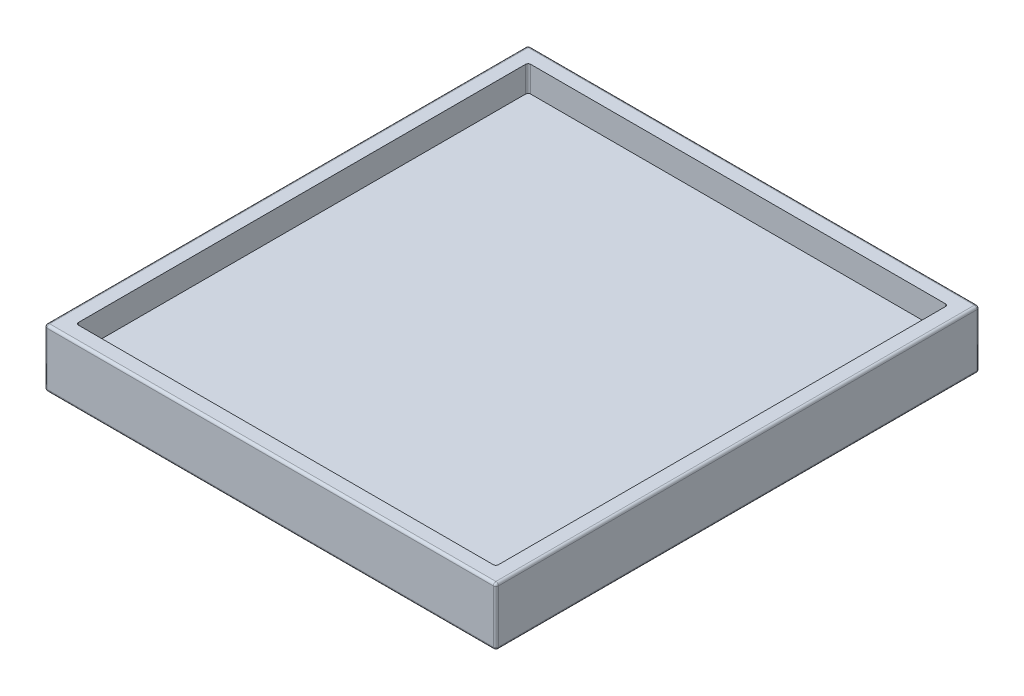
ISO-10303-21;
HEADER;
FILE_DESCRIPTION(('STEP AP214'),'2;1');
FILE_NAME('part.step','',(''),(''),'','','');
FILE_SCHEMA(('AUTOMOTIVE_DESIGN { 1 0 10303 214 1 1 1 1 }'));
ENDSEC;
DATA;
#1=APPLICATION_CONTEXT('core data for automotive mechanical design processes');
#2=APPLICATION_PROTOCOL_DEFINITION('international standard','automotive_design',2000,#1);
#3=PRODUCT_CONTEXT('',#1,'mechanical');
#4=PRODUCT('Part','Part','',(#3));
#5=PRODUCT_RELATED_PRODUCT_CATEGORY('part','',(#4));
#6=PRODUCT_DEFINITION_FORMATION('','',#4);
#7=PRODUCT_DEFINITION_CONTEXT('part definition',#1,'design');
#8=PRODUCT_DEFINITION('design','',#6,#7);
#9=PRODUCT_DEFINITION_SHAPE('','',#8);
#10=(LENGTH_UNIT() NAMED_UNIT(*) SI_UNIT(.MILLI.,.METRE.));
#11=(NAMED_UNIT(*) PLANE_ANGLE_UNIT() SI_UNIT($,.RADIAN.));
#12=(NAMED_UNIT(*) SI_UNIT($,.STERADIAN.) SOLID_ANGLE_UNIT());
#13=UNCERTAINTY_MEASURE_WITH_UNIT(LENGTH_MEASURE(1.E-05),#10,'distance_accuracy_value','');
#14=(GEOMETRIC_REPRESENTATION_CONTEXT(3) GLOBAL_UNCERTAINTY_ASSIGNED_CONTEXT((#13)) GLOBAL_UNIT_ASSIGNED_CONTEXT((#10,
#11,#12)) REPRESENTATION_CONTEXT('',''));
#15=CARTESIAN_POINT('',(0.,0.,0.));
#16=DIRECTION('',(0.,0.,1.));
#17=DIRECTION('',(1.,0.,0.));
#18=AXIS2_PLACEMENT_3D('',#15,#16,#17);
#19=CARTESIAN_POINT('',(0.,9.,0.));
#20=DIRECTION('',(1.,0.,0.));
#21=DIRECTION('',(0.,0.,-1.));
#22=AXIS2_PLACEMENT_3D('',#19,#20,#21);
#23=PLANE('',#22);
#24=DIRECTION('',(0.,0.,1.));
#25=VECTOR('',#24,1.);
#26=CARTESIAN_POINT('',(0.,8.6,0.));
#27=LINE('',#26,#25);
#28=CARTESIAN_POINT('',(0.,8.6,-0.4));
#29=VERTEX_POINT('',#28);
#30=CARTESIAN_POINT('',(0.,8.6,-74.6));
#31=VERTEX_POINT('',#30);
#32=EDGE_CURVE('E281',#29,#31,#27,.F.);
#33=ORIENTED_EDGE('',*,*,#32,.T.);
#34=DIRECTION('',(0.,-1.,0.));
#35=VECTOR('',#34,1.);
#36=CARTESIAN_POINT('',(0.,9.,-74.6));
#37=LINE('',#36,#35);
#38=CARTESIAN_POINT('',(0.,0.399999999999999,-74.6));
#39=VERTEX_POINT('',#38);
#40=EDGE_CURVE('E284',#31,#39,#37,.T.);
#41=ORIENTED_EDGE('',*,*,#40,.T.);
#42=DIRECTION('',(0.,0.,1.));
#43=VECTOR('',#42,1.);
#44=CARTESIAN_POINT('',(0.,0.399999999999999,0.));
#45=LINE('',#44,#43);
#46=CARTESIAN_POINT('',(0.,0.399999999999999,-0.4));
#47=VERTEX_POINT('',#46);
#48=EDGE_CURVE('E279',#39,#47,#45,.T.);
#49=ORIENTED_EDGE('',*,*,#48,.T.);
#50=DIRECTION('',(0.,-1.,0.));
#51=VECTOR('',#50,1.);
#52=CARTESIAN_POINT('',(0.,9.,-0.4));
#53=LINE('',#52,#51);
#54=EDGE_CURVE('E277',#47,#29,#53,.F.);
#55=ORIENTED_EDGE('',*,*,#54,.T.);
#56=EDGE_LOOP('',(#33,#41,#49,#55));
#57=FACE_BOUND('',#56,.T.);
#58=ADVANCED_FACE('F43',(#57),#23,.F.);
#59=CARTESIAN_POINT('',(0.,9.,0.));
#60=DIRECTION('',(0.,0.,-1.));
#61=DIRECTION('',(-1.,0.,0.));
#62=AXIS2_PLACEMENT_3D('',#59,#60,#61);
#63=PLANE('',#62);
#64=DIRECTION('',(1.,0.,0.));
#65=VECTOR('',#64,1.);
#66=CARTESIAN_POINT('',(70.,0.399999999999999,0.));
#67=LINE('',#66,#65);
#68=CARTESIAN_POINT('',(0.4,0.399999999999999,0.));
#69=VERTEX_POINT('',#68);
#70=CARTESIAN_POINT('',(69.6,0.399999999999999,0.));
#71=VERTEX_POINT('',#70);
#72=EDGE_CURVE('E191',#69,#71,#67,.T.);
#73=ORIENTED_EDGE('',*,*,#72,.T.);
#74=DIRECTION('',(0.,-1.,0.));
#75=VECTOR('',#74,1.);
#76=CARTESIAN_POINT('',(69.6,9.,0.));
#77=LINE('',#76,#75);
#78=CARTESIAN_POINT('',(69.6,8.6,0.));
#79=VERTEX_POINT('',#78);
#80=EDGE_CURVE('E248',#71,#79,#77,.F.);
#81=ORIENTED_EDGE('',*,*,#80,.T.);
#82=DIRECTION('',(1.,0.,0.));
#83=VECTOR('',#82,1.);
#84=CARTESIAN_POINT('',(0.,8.6,0.));
#85=LINE('',#84,#83);
#86=CARTESIAN_POINT('',(0.4,8.6,0.));
#87=VERTEX_POINT('',#86);
#88=EDGE_CURVE('E245',#79,#87,#85,.F.);
#89=ORIENTED_EDGE('',*,*,#88,.T.);
#90=DIRECTION('',(0.,-1.,0.));
#91=VECTOR('',#90,1.);
#92=CARTESIAN_POINT('',(0.4,9.,0.));
#93=LINE('',#92,#91);
#94=EDGE_CURVE('E243',#87,#69,#93,.T.);
#95=ORIENTED_EDGE('',*,*,#94,.T.);
#96=EDGE_LOOP('',(#73,#81,#89,#95));
#97=FACE_BOUND('',#96,.T.);
#98=ADVANCED_FACE('F425',(#97),#63,.F.);
#99=CARTESIAN_POINT('',(70.,9.,0.));
#100=DIRECTION('',(-1.,0.,0.));
#101=DIRECTION('',(0.,0.,1.));
#102=AXIS2_PLACEMENT_3D('',#99,#100,#101);
#103=PLANE('',#102);
#104=DIRECTION('',(0.,0.,-1.));
#105=VECTOR('',#104,1.);
#106=CARTESIAN_POINT('',(70.,0.399999999999999,-75.));
#107=LINE('',#106,#105);
#108=CARTESIAN_POINT('',(70.,0.399999999999999,-0.4));
#109=VERTEX_POINT('',#108);
#110=CARTESIAN_POINT('',(70.,0.399999999999999,-74.6));
#111=VERTEX_POINT('',#110);
#112=EDGE_CURVE('E254',#109,#111,#107,.T.);
#113=ORIENTED_EDGE('',*,*,#112,.T.);
#114=DIRECTION('',(0.,-1.,0.));
#115=VECTOR('',#114,1.);
#116=CARTESIAN_POINT('',(70.,9.,-74.6));
#117=LINE('',#116,#115);
#118=CARTESIAN_POINT('',(70.,8.6,-74.6));
#119=VERTEX_POINT('',#118);
#120=EDGE_CURVE('E257',#111,#119,#117,.F.);
#121=ORIENTED_EDGE('',*,*,#120,.T.);
#122=DIRECTION('',(0.,0.,-1.));
#123=VECTOR('',#122,1.);
#124=CARTESIAN_POINT('',(70.,8.6,0.));
#125=LINE('',#124,#123);
#126=CARTESIAN_POINT('',(70.,8.6,-0.4));
#127=VERTEX_POINT('',#126);
#128=EDGE_CURVE('E252',#119,#127,#125,.F.);
#129=ORIENTED_EDGE('',*,*,#128,.T.);
#130=DIRECTION('',(0.,-1.,0.));
#131=VECTOR('',#130,1.);
#132=CARTESIAN_POINT('',(70.,9.,-0.4));
#133=LINE('',#132,#131);
#134=EDGE_CURVE('E250',#127,#109,#133,.T.);
#135=ORIENTED_EDGE('',*,*,#134,.T.);
#136=EDGE_LOOP('',(#113,#121,#129,#135));
#137=FACE_BOUND('',#136,.T.);
#138=ADVANCED_FACE('F474',(#137),#103,.F.);
#139=CARTESIAN_POINT('',(0.,9.,-75.));
#140=DIRECTION('',(0.,0.,1.));
#141=DIRECTION('',(1.,0.,0.));
#142=AXIS2_PLACEMENT_3D('',#139,#140,#141);
#143=PLANE('',#142);
#144=DIRECTION('',(-1.,0.,0.));
#145=VECTOR('',#144,1.);
#146=CARTESIAN_POINT('',(0.,0.399999999999999,-75.));
#147=LINE('',#146,#145);
#148=CARTESIAN_POINT('',(69.6,0.399999999999999,-75.));
#149=VERTEX_POINT('',#148);
#150=CARTESIAN_POINT('',(0.4,0.399999999999999,-75.));
#151=VERTEX_POINT('',#150);
#152=EDGE_CURVE('E263',#149,#151,#147,.T.);
#153=ORIENTED_EDGE('',*,*,#152,.T.);
#154=DIRECTION('',(0.,-1.,0.));
#155=VECTOR('',#154,1.);
#156=CARTESIAN_POINT('',(0.4,9.,-75.));
#157=LINE('',#156,#155);
#158=CARTESIAN_POINT('',(0.4,8.6,-75.));
#159=VERTEX_POINT('',#158);
#160=EDGE_CURVE('E266',#151,#159,#157,.F.);
#161=ORIENTED_EDGE('',*,*,#160,.T.);
#162=DIRECTION('',(-1.,0.,0.));
#163=VECTOR('',#162,1.);
#164=CARTESIAN_POINT('',(0.,8.6,-75.));
#165=LINE('',#164,#163);
#166=CARTESIAN_POINT('',(69.6,8.6,-75.));
#167=VERTEX_POINT('',#166);
#168=EDGE_CURVE('E261',#159,#167,#165,.F.);
#169=ORIENTED_EDGE('',*,*,#168,.T.);
#170=DIRECTION('',(0.,-1.,0.));
#171=VECTOR('',#170,1.);
#172=CARTESIAN_POINT('',(69.6,9.,-75.));
#173=LINE('',#172,#171);
#174=EDGE_CURVE('E259',#167,#149,#173,.T.);
#175=ORIENTED_EDGE('',*,*,#174,.T.);
#176=EDGE_LOOP('',(#153,#161,#169,#175));
#177=FACE_BOUND('',#176,.T.);
#178=ADVANCED_FACE('F524',(#177),#143,.F.);
#179=CARTESIAN_POINT('',(0.,9.,0.));
#180=DIRECTION('',(0.,-1.,0.));
#181=DIRECTION('',(0.,0.,-1.));
#182=AXIS2_PLACEMENT_3D('',#179,#180,#181);
#183=PLANE('',#182);
#184=DIRECTION('',(-1.,0.,0.));
#185=VECTOR('',#184,1.);
#186=CARTESIAN_POINT('',(0.,9.,-74.6));
#187=LINE('',#186,#185);
#188=CARTESIAN_POINT('',(69.6,9.,-74.6));
#189=VERTEX_POINT('',#188);
#190=CARTESIAN_POINT('',(0.4,9.,-74.6));
#191=VERTEX_POINT('',#190);
#192=EDGE_CURVE('E268',#189,#191,#187,.T.);
#193=ORIENTED_EDGE('',*,*,#192,.T.);
#194=DIRECTION('',(0.,0.,1.));
#195=VECTOR('',#194,1.);
#196=CARTESIAN_POINT('',(0.4,9.,0.));
#197=LINE('',#196,#195);
#198=CARTESIAN_POINT('',(0.4,9.,-0.4));
#199=VERTEX_POINT('',#198);
#200=EDGE_CURVE('E274',#191,#199,#197,.T.);
#201=ORIENTED_EDGE('',*,*,#200,.T.);
#202=DIRECTION('',(1.,0.,0.));
#203=VECTOR('',#202,1.);
#204=CARTESIAN_POINT('',(0.,9.,-0.4));
#205=LINE('',#204,#203);
#206=CARTESIAN_POINT('',(69.6,9.,-0.4));
#207=VERTEX_POINT('',#206);
#208=EDGE_CURVE('E272',#199,#207,#205,.T.);
#209=ORIENTED_EDGE('',*,*,#208,.T.);
#210=DIRECTION('',(0.,0.,-1.));
#211=VECTOR('',#210,1.);
#212=CARTESIAN_POINT('',(69.6,9.,0.));
#213=LINE('',#212,#211);
#214=EDGE_CURVE('E270',#207,#189,#213,.T.);
#215=ORIENTED_EDGE('',*,*,#214,.T.);
#216=EDGE_LOOP('',(#193,#201,#209,#215));
#217=FACE_BOUND('',#216,.T.);
#218=DIRECTION('',(0.,0.,1.));
#219=VECTOR('',#218,1.);
#220=CARTESIAN_POINT('',(2.45000000000002,9.,-2.45000000000002));
#221=LINE('',#220,#219);
#222=CARTESIAN_POINT('',(2.45000000000002,9.,-72.15));
#223=VERTEX_POINT('',#222);
#224=CARTESIAN_POINT('',(2.45000000000002,9.,-2.85000000000002));
#225=VERTEX_POINT('',#224);
#226=EDGE_CURVE('E383',#223,#225,#221,.T.);
#227=ORIENTED_EDGE('',*,*,#226,.F.);
#228=CARTESIAN_POINT('',(2.85000000000002,8.99999999999999,-72.15));
#229=DIRECTION('',(0.,-1.,0.));
#230=DIRECTION('',(0.,0.,-1.));
#231=AXIS2_PLACEMENT_3D('',#228,#229,#230);
#232=CIRCLE('',#231,0.4);
#233=CARTESIAN_POINT('',(2.85000000000002,9.,-72.55));
#234=VERTEX_POINT('',#233);
#235=EDGE_CURVE('E12',#223,#234,#232,.T.);
#236=ORIENTED_EDGE('',*,*,#235,.T.);
#237=DIRECTION('',(-1.,0.,0.));
#238=VECTOR('',#237,1.);
#239=CARTESIAN_POINT('',(2.45000000000002,9.,-72.55));
#240=LINE('',#239,#238);
#241=CARTESIAN_POINT('',(67.15,9.,-72.55));
#242=VERTEX_POINT('',#241);
#243=EDGE_CURVE('E378',#242,#234,#240,.T.);
#244=ORIENTED_EDGE('',*,*,#243,.F.);
#245=CARTESIAN_POINT('',(67.15,8.99999999999999,-72.15));
#246=DIRECTION('',(0.,-1.,0.));
#247=DIRECTION('',(0.,0.,-1.));
#248=AXIS2_PLACEMENT_3D('',#245,#246,#247);
#249=CIRCLE('',#248,0.4);
#250=CARTESIAN_POINT('',(67.55,9.,-72.15));
#251=VERTEX_POINT('',#250);
#252=EDGE_CURVE('E52',#242,#251,#249,.T.);
#253=ORIENTED_EDGE('',*,*,#252,.T.);
#254=DIRECTION('',(0.,0.,-1.));
#255=VECTOR('',#254,1.);
#256=CARTESIAN_POINT('',(67.55,9.,-2.45000000000002));
#257=LINE('',#256,#255);
#258=CARTESIAN_POINT('',(67.55,9.,-2.85000000000002));
#259=VERTEX_POINT('',#258);
#260=EDGE_CURVE('E372',#259,#251,#257,.T.);
#261=ORIENTED_EDGE('',*,*,#260,.F.);
#262=CARTESIAN_POINT('',(67.15,8.99999999999999,-2.85000000000002));
#263=DIRECTION('',(0.,-1.,0.));
#264=DIRECTION('',(0.,0.,-1.));
#265=AXIS2_PLACEMENT_3D('',#262,#263,#264);
#266=CIRCLE('',#265,0.4);
#267=CARTESIAN_POINT('',(67.15,9.,-2.45000000000002));
#268=VERTEX_POINT('',#267);
#269=EDGE_CURVE('E314',#259,#268,#266,.T.);
#270=ORIENTED_EDGE('',*,*,#269,.T.);
#271=DIRECTION('',(1.,0.,0.));
#272=VECTOR('',#271,1.);
#273=CARTESIAN_POINT('',(2.45000000000002,9.,-2.45000000000002));
#274=LINE('',#273,#272);
#275=CARTESIAN_POINT('',(2.85000000000002,9.,-2.45000000000002));
#276=VERTEX_POINT('',#275);
#277=EDGE_CURVE('E390',#276,#268,#274,.T.);
#278=ORIENTED_EDGE('',*,*,#277,.F.);
#279=CARTESIAN_POINT('',(2.85000000000002,8.99999999999999,-2.85000000000002));
#280=DIRECTION('',(0.,-1.,0.));
#281=DIRECTION('',(0.,0.,-1.));
#282=AXIS2_PLACEMENT_3D('',#279,#280,#281);
#283=CIRCLE('',#282,0.4);
#284=EDGE_CURVE('E312',#276,#225,#283,.T.);
#285=ORIENTED_EDGE('',*,*,#284,.T.);
#286=EDGE_LOOP('',(#227,#236,#244,#253,#261,#270,#278,#285));
#287=FACE_BOUND('',#286,.T.);
#288=ADVANCED_FACE('F446',(#217,#287),#183,.F.);
#289=CARTESIAN_POINT('',(0.,0.,0.));
#290=DIRECTION('',(0.,-1.,0.));
#291=DIRECTION('',(0.,0.,-1.));
#292=AXIS2_PLACEMENT_3D('',#289,#290,#291);
#293=PLANE('',#292);
#294=CARTESIAN_POINT('',(52.5,0.,-54.));
#295=DIRECTION('',(0.,-1.,0.));
#296=DIRECTION('',(0.,0.,-1.));
#297=AXIS2_PLACEMENT_3D('',#294,#295,#296);
#298=CIRCLE('',#297,2.9);
#299=CARTESIAN_POINT('',(52.5,0.,-56.9));
#300=VERTEX_POINT('',#299);
#301=EDGE_CURVE('E224',#300,#300,#298,.F.);
#302=ORIENTED_EDGE('',*,*,#301,.T.);
#303=EDGE_LOOP('',(#302));
#304=FACE_BOUND('',#303,.T.);
#305=CARTESIAN_POINT('',(17.5,0.,-54.));
#306=DIRECTION('',(0.,-1.,0.));
#307=DIRECTION('',(0.,0.,-1.));
#308=AXIS2_PLACEMENT_3D('',#305,#306,#307);
#309=CIRCLE('',#308,2.90000000000001);
#310=CARTESIAN_POINT('',(17.5,0.,-56.9));
#311=VERTEX_POINT('',#310);
#312=EDGE_CURVE('E221',#311,#311,#309,.F.);
#313=ORIENTED_EDGE('',*,*,#312,.T.);
#314=EDGE_LOOP('',(#313));
#315=FACE_BOUND('',#314,.T.);
#316=DIRECTION('',(0.,0.,-1.));
#317=VECTOR('',#316,1.);
#318=CARTESIAN_POINT('',(69.6,0.,0.));
#319=LINE('',#318,#317);
#320=CARTESIAN_POINT('',(69.6,0.,-74.6));
#321=VERTEX_POINT('',#320);
#322=CARTESIAN_POINT('',(69.6,0.,-0.4));
#323=VERTEX_POINT('',#322);
#324=EDGE_CURVE('E219',#321,#323,#319,.F.);
#325=ORIENTED_EDGE('',*,*,#324,.T.);
#326=DIRECTION('',(1.,0.,0.));
#327=VECTOR('',#326,1.);
#328=CARTESIAN_POINT('',(0.,0.,-0.4));
#329=LINE('',#328,#327);
#330=CARTESIAN_POINT('',(0.4,0.,-0.4));
#331=VERTEX_POINT('',#330);
#332=EDGE_CURVE('E188',#323,#331,#329,.F.);
#333=ORIENTED_EDGE('',*,*,#332,.T.);
#334=DIRECTION('',(0.,0.,1.));
#335=VECTOR('',#334,1.);
#336=CARTESIAN_POINT('',(0.4,0.,-75.));
#337=LINE('',#336,#335);
#338=CARTESIAN_POINT('',(0.4,0.,-74.6));
#339=VERTEX_POINT('',#338);
#340=EDGE_CURVE('E208',#331,#339,#337,.F.);
#341=ORIENTED_EDGE('',*,*,#340,.T.);
#342=DIRECTION('',(-1.,0.,0.));
#343=VECTOR('',#342,1.);
#344=CARTESIAN_POINT('',(70.,0.,-74.6));
#345=LINE('',#344,#343);
#346=EDGE_CURVE('E214',#339,#321,#345,.F.);
#347=ORIENTED_EDGE('',*,*,#346,.T.);
#348=EDGE_LOOP('',(#325,#333,#341,#347));
#349=FACE_BOUND('',#348,.T.);
#350=ADVANCED_FACE('F217',(#304,#315,#349),#293,.T.);
#351=CARTESIAN_POINT('',(0.,5.,0.));
#352=DIRECTION('',(0.,-1.,0.));
#353=DIRECTION('',(0.,0.,-1.));
#354=AXIS2_PLACEMENT_3D('',#351,#352,#353);
#355=PLANE('',#354);
#356=DIRECTION('',(0.,0.,1.));
#357=VECTOR('',#356,1.);
#358=CARTESIAN_POINT('',(2.45000000000002,5.,-2.45000000000002));
#359=LINE('',#358,#357);
#360=CARTESIAN_POINT('',(2.45000000000002,5.,-72.15));
#361=VERTEX_POINT('',#360);
#362=CARTESIAN_POINT('',(2.45000000000002,5.,-2.85000000000002));
#363=VERTEX_POINT('',#362);
#364=EDGE_CURVE('E389',#361,#363,#359,.T.);
#365=ORIENTED_EDGE('',*,*,#364,.T.);
#366=CARTESIAN_POINT('',(2.85000000000002,5.,-2.85000000000002));
#367=DIRECTION('',(0.,-1.,0.));
#368=DIRECTION('',(0.,0.,-1.));
#369=AXIS2_PLACEMENT_3D('',#366,#367,#368);
#370=CIRCLE('',#369,0.4);
#371=CARTESIAN_POINT('',(2.85000000000002,5.,-2.45000000000002));
#372=VERTEX_POINT('',#371);
#373=EDGE_CURVE('E301',#363,#372,#370,.F.);
#374=ORIENTED_EDGE('',*,*,#373,.T.);
#375=DIRECTION('',(1.,0.,0.));
#376=VECTOR('',#375,1.);
#377=CARTESIAN_POINT('',(2.45000000000002,5.,-2.45000000000002));
#378=LINE('',#377,#376);
#379=CARTESIAN_POINT('',(67.15,5.,-2.45000000000002));
#380=VERTEX_POINT('',#379);
#381=EDGE_CURVE('E394',#372,#380,#378,.T.);
#382=ORIENTED_EDGE('',*,*,#381,.T.);
#383=CARTESIAN_POINT('',(67.15,5.,-2.85000000000002));
#384=DIRECTION('',(0.,-1.,0.));
#385=DIRECTION('',(0.,0.,-1.));
#386=AXIS2_PLACEMENT_3D('',#383,#384,#385);
#387=CIRCLE('',#386,0.4);
#388=CARTESIAN_POINT('',(67.55,5.,-2.85000000000002));
#389=VERTEX_POINT('',#388);
#390=EDGE_CURVE('E299',#380,#389,#387,.F.);
#391=ORIENTED_EDGE('',*,*,#390,.T.);
#392=DIRECTION('',(0.,0.,-1.));
#393=VECTOR('',#392,1.);
#394=CARTESIAN_POINT('',(67.55,5.,-2.45000000000002));
#395=LINE('',#394,#393);
#396=CARTESIAN_POINT('',(67.55,5.,-72.15));
#397=VERTEX_POINT('',#396);
#398=EDGE_CURVE('E391',#389,#397,#395,.T.);
#399=ORIENTED_EDGE('',*,*,#398,.T.);
#400=CARTESIAN_POINT('',(67.15,5.,-72.15));
#401=DIRECTION('',(0.,-1.,0.));
#402=DIRECTION('',(0.,0.,-1.));
#403=AXIS2_PLACEMENT_3D('',#400,#401,#402);
#404=CIRCLE('',#403,0.4);
#405=CARTESIAN_POINT('',(67.15,5.,-72.55));
#406=VERTEX_POINT('',#405);
#407=EDGE_CURVE('E67',#397,#406,#404,.F.);
#408=ORIENTED_EDGE('',*,*,#407,.T.);
#409=DIRECTION('',(-1.,0.,0.));
#410=VECTOR('',#409,1.);
#411=CARTESIAN_POINT('',(2.45000000000002,5.,-72.55));
#412=LINE('',#411,#410);
#413=CARTESIAN_POINT('',(2.85000000000002,5.,-72.55));
#414=VERTEX_POINT('',#413);
#415=EDGE_CURVE('E387',#406,#414,#412,.T.);
#416=ORIENTED_EDGE('',*,*,#415,.T.);
#417=CARTESIAN_POINT('',(2.85000000000002,5.,-72.15));
#418=DIRECTION('',(0.,-1.,0.));
#419=DIRECTION('',(0.,0.,-1.));
#420=AXIS2_PLACEMENT_3D('',#417,#418,#419);
#421=CIRCLE('',#420,0.4);
#422=EDGE_CURVE('E296',#414,#361,#421,.F.);
#423=ORIENTED_EDGE('',*,*,#422,.T.);
#424=EDGE_LOOP('',(#365,#374,#382,#391,#399,#408,#416,#423));
#425=FACE_BOUND('',#424,.T.);
#426=ADVANCED_FACE('F535',(#425),#355,.F.);
#427=CARTESIAN_POINT('',(2.45000000000002,-95.6661904750053,-72.55));
#428=DIRECTION('',(0.,0.,-1.));
#429=DIRECTION('',(-1.,0.,0.));
#430=AXIS2_PLACEMENT_3D('',#427,#428,#429);
#431=PLANE('',#430);
#432=ORIENTED_EDGE('',*,*,#415,.F.);
#433=DIRECTION('',(0.,1.,0.));
#434=VECTOR('',#433,1.);
#435=CARTESIAN_POINT('',(67.15,8.99999999999999,-72.55));
#436=LINE('',#435,#434);
#437=EDGE_CURVE('E309',#406,#242,#436,.T.);
#438=ORIENTED_EDGE('',*,*,#437,.T.);
#439=ORIENTED_EDGE('',*,*,#243,.T.);
#440=DIRECTION('',(0.,1.,0.));
#441=VECTOR('',#440,1.);
#442=CARTESIAN_POINT('',(2.85000000000002,4.99999999999998,-72.55));
#443=LINE('',#442,#441);
#444=EDGE_CURVE('E60',#234,#414,#443,.F.);
#445=ORIENTED_EDGE('',*,*,#444,.T.);
#446=EDGE_LOOP('',(#432,#438,#439,#445));
#447=FACE_BOUND('',#446,.T.);
#448=ADVANCED_FACE('F540',(#447),#431,.F.);
#449=CARTESIAN_POINT('',(2.45000000000002,-95.6661904750053,-2.45000000000002));
#450=DIRECTION('',(-1.,0.,0.));
#451=DIRECTION('',(0.,0.,1.));
#452=AXIS2_PLACEMENT_3D('',#449,#450,#451);
#453=PLANE('',#452);
#454=ORIENTED_EDGE('',*,*,#226,.T.);
#455=DIRECTION('',(0.,1.,0.));
#456=VECTOR('',#455,1.);
#457=CARTESIAN_POINT('',(2.45000000000002,5.,-2.85000000000002));
#458=LINE('',#457,#456);
#459=EDGE_CURVE('E294',#225,#363,#458,.F.);
#460=ORIENTED_EDGE('',*,*,#459,.T.);
#461=ORIENTED_EDGE('',*,*,#364,.F.);
#462=DIRECTION('',(0.,1.,0.));
#463=VECTOR('',#462,1.);
#464=CARTESIAN_POINT('',(2.45000000000002,8.99999999999999,-72.15));
#465=LINE('',#464,#463);
#466=EDGE_CURVE('E291',#361,#223,#465,.T.);
#467=ORIENTED_EDGE('',*,*,#466,.T.);
#468=EDGE_LOOP('',(#454,#460,#461,#467));
#469=FACE_BOUND('',#468,.T.);
#470=ADVANCED_FACE('F543',(#469),#453,.F.);
#471=CARTESIAN_POINT('',(2.45000000000002,-95.6661904750053,-2.45000000000002));
#472=DIRECTION('',(0.,0.,1.));
#473=DIRECTION('',(1.,0.,0.));
#474=AXIS2_PLACEMENT_3D('',#471,#472,#473);
#475=PLANE('',#474);
#476=ORIENTED_EDGE('',*,*,#381,.F.);
#477=DIRECTION('',(0.,1.,0.));
#478=VECTOR('',#477,1.);
#479=CARTESIAN_POINT('',(2.85000000000002,8.99999999999999,-2.45000000000002));
#480=LINE('',#479,#478);
#481=EDGE_CURVE('E288',#372,#276,#480,.T.);
#482=ORIENTED_EDGE('',*,*,#481,.T.);
#483=ORIENTED_EDGE('',*,*,#277,.T.);
#484=DIRECTION('',(0.,1.,0.));
#485=VECTOR('',#484,1.);
#486=CARTESIAN_POINT('',(67.15,5.,-2.45000000000002));
#487=LINE('',#486,#485);
#488=EDGE_CURVE('E286',#268,#380,#487,.F.);
#489=ORIENTED_EDGE('',*,*,#488,.T.);
#490=EDGE_LOOP('',(#476,#482,#483,#489));
#491=FACE_BOUND('',#490,.T.);
#492=ADVANCED_FACE('F546',(#491),#475,.F.);
#493=CARTESIAN_POINT('',(67.55,-95.6661904750053,-2.45000000000002));
#494=DIRECTION('',(1.,0.,0.));
#495=DIRECTION('',(0.,0.,-1.));
#496=AXIS2_PLACEMENT_3D('',#493,#494,#495);
#497=PLANE('',#496);
#498=ORIENTED_EDGE('',*,*,#398,.F.);
#499=DIRECTION('',(0.,1.,0.));
#500=VECTOR('',#499,1.);
#501=CARTESIAN_POINT('',(67.55,8.99999999999999,-2.85000000000002));
#502=LINE('',#501,#500);
#503=EDGE_CURVE('E305',#389,#259,#502,.T.);
#504=ORIENTED_EDGE('',*,*,#503,.T.);
#505=ORIENTED_EDGE('',*,*,#260,.T.);
#506=DIRECTION('',(0.,1.,0.));
#507=VECTOR('',#506,1.);
#508=CARTESIAN_POINT('',(67.55,5.,-72.15));
#509=LINE('',#508,#507);
#510=EDGE_CURVE('E303',#251,#397,#509,.F.);
#511=ORIENTED_EDGE('',*,*,#510,.T.);
#512=EDGE_LOOP('',(#498,#504,#505,#511));
#513=FACE_BOUND('',#512,.T.);
#514=ADVANCED_FACE('F550',(#513),#497,.F.);
#515=CARTESIAN_POINT('',(17.5,-7.5,-54.));
#516=DIRECTION('',(0.,1.,0.));
#517=DIRECTION('',(0.,0.,1.));
#518=AXIS2_PLACEMENT_3D('',#515,#516,#517);
#519=CYLINDRICAL_SURFACE('',#518,2.50000000000001);
#520=CARTESIAN_POINT('',(17.5,-0.4,-54.));
#521=DIRECTION('',(0.,-1.,0.));
#522=DIRECTION('',(0.,0.,-1.));
#523=AXIS2_PLACEMENT_3D('',#520,#521,#522);
#524=CIRCLE('',#523,2.50000000000001);
#525=CARTESIAN_POINT('',(17.5,-0.4,-56.5));
#526=VERTEX_POINT('',#525);
#527=EDGE_CURVE('E234',#526,#526,#524,.T.);
#528=ORIENTED_EDGE('',*,*,#527,.T.);
#529=EDGE_LOOP('',(#528));
#530=FACE_BOUND('',#529,.T.);
#531=CARTESIAN_POINT('',(17.5,-7.1,-54.));
#532=DIRECTION('',(0.,-1.,0.));
#533=DIRECTION('',(0.,0.,-1.));
#534=AXIS2_PLACEMENT_3D('',#531,#532,#533);
#535=CIRCLE('',#534,2.50000000000001);
#536=CARTESIAN_POINT('',(17.5,-7.1,-56.5));
#537=VERTEX_POINT('',#536);
#538=EDGE_CURVE('E231',#537,#537,#535,.F.);
#539=ORIENTED_EDGE('',*,*,#538,.T.);
#540=EDGE_LOOP('',(#539));
#541=FACE_BOUND('',#540,.T.);
#542=ADVANCED_FACE('F554',(#530,#541),#519,.T.);
#543=CARTESIAN_POINT('',(17.5,-7.5,-54.));
#544=DIRECTION('',(0.,-1.,0.));
#545=DIRECTION('',(0.,0.,-1.));
#546=AXIS2_PLACEMENT_3D('',#543,#544,#545);
#547=PLANE('',#546);
#548=CARTESIAN_POINT('',(17.5,-7.5,-54.));
#549=DIRECTION('',(0.,-1.,0.));
#550=DIRECTION('',(0.,0.,-1.));
#551=AXIS2_PLACEMENT_3D('',#548,#549,#550);
#552=CIRCLE('',#551,2.10000000000001);
#553=CARTESIAN_POINT('',(17.5,-7.5,-56.1));
#554=VERTEX_POINT('',#553);
#555=EDGE_CURVE('E240',#554,#554,#552,.T.);
#556=ORIENTED_EDGE('',*,*,#555,.T.);
#557=EDGE_LOOP('',(#556));
#558=FACE_BOUND('',#557,.T.);
#559=ADVANCED_FACE('F557',(#558),#547,.T.);
#560=CARTESIAN_POINT('',(52.5,-7.5,-54.));
#561=DIRECTION('',(0.,1.,0.));
#562=DIRECTION('',(0.,0.,1.));
#563=AXIS2_PLACEMENT_3D('',#560,#561,#562);
#564=CYLINDRICAL_SURFACE('',#563,2.5);
#565=CARTESIAN_POINT('',(52.5,-0.4,-54.));
#566=DIRECTION('',(0.,-1.,0.));
#567=DIRECTION('',(0.,0.,-1.));
#568=AXIS2_PLACEMENT_3D('',#565,#566,#567);
#569=CIRCLE('',#568,2.5);
#570=CARTESIAN_POINT('',(52.5,-0.4,-56.5));
#571=VERTEX_POINT('',#570);
#572=EDGE_CURVE('E215',#571,#571,#569,.T.);
#573=ORIENTED_EDGE('',*,*,#572,.T.);
#574=EDGE_LOOP('',(#573));
#575=FACE_BOUND('',#574,.T.);
#576=CARTESIAN_POINT('',(52.5,-7.1,-54.));
#577=DIRECTION('',(0.,1.,0.));
#578=DIRECTION('',(0.,0.,1.));
#579=AXIS2_PLACEMENT_3D('',#576,#577,#578);
#580=CIRCLE('',#579,2.5);
#581=CARTESIAN_POINT('',(52.5,-7.1,-51.5));
#582=VERTEX_POINT('',#581);
#583=EDGE_CURVE('E393',#582,#582,#580,.T.);
#584=ORIENTED_EDGE('',*,*,#583,.T.);
#585=EDGE_LOOP('',(#584));
#586=FACE_BOUND('',#585,.T.);
#587=ADVANCED_FACE('F561',(#575,#586),#564,.T.);
#588=CARTESIAN_POINT('',(52.5,-7.5,-54.));
#589=DIRECTION('',(0.,1.,0.));
#590=DIRECTION('',(0.,0.,1.));
#591=AXIS2_PLACEMENT_3D('',#588,#589,#590);
#592=PLANE('',#591);
#593=CARTESIAN_POINT('',(52.5,-7.5,-54.));
#594=DIRECTION('',(0.,1.,0.));
#595=DIRECTION('',(0.,0.,1.));
#596=AXIS2_PLACEMENT_3D('',#593,#594,#595);
#597=CIRCLE('',#596,2.1);
#598=CARTESIAN_POINT('',(52.5,-7.5,-51.9));
#599=VERTEX_POINT('',#598);
#600=EDGE_CURVE('E237',#599,#599,#597,.F.);
#601=ORIENTED_EDGE('',*,*,#600,.T.);
#602=EDGE_LOOP('',(#601));
#603=FACE_BOUND('',#602,.T.);
#604=ADVANCED_FACE('F482',(#603),#592,.F.);
#605=CARTESIAN_POINT('',(52.5,-0.4,-54.));
#606=DIRECTION('',(0.,-1.,0.));
#607=DIRECTION('',(0.,0.,-1.));
#608=AXIS2_PLACEMENT_3D('',#605,#606,#607);
#609=TOROIDAL_SURFACE('',#608,2.9,0.4);
#610=ORIENTED_EDGE('',*,*,#301,.F.);
#611=EDGE_LOOP('',(#610));
#612=FACE_BOUND('',#611,.T.);
#613=ORIENTED_EDGE('',*,*,#572,.F.);
#614=EDGE_LOOP('',(#613));
#615=FACE_BOUND('',#614,.T.);
#616=ADVANCED_FACE('F478',(#612,#615),#609,.F.);
#617=CARTESIAN_POINT('',(17.5,-0.4,-54.));
#618=DIRECTION('',(0.,-1.,0.));
#619=DIRECTION('',(0.,0.,-1.));
#620=AXIS2_PLACEMENT_3D('',#617,#618,#619);
#621=TOROIDAL_SURFACE('',#620,2.90000000000001,0.4);
#622=ORIENTED_EDGE('',*,*,#312,.F.);
#623=EDGE_LOOP('',(#622));
#624=FACE_BOUND('',#623,.T.);
#625=ORIENTED_EDGE('',*,*,#527,.F.);
#626=EDGE_LOOP('',(#625));
#627=FACE_BOUND('',#626,.T.);
#628=ADVANCED_FACE('F481',(#624,#627),#621,.F.);
#629=CARTESIAN_POINT('',(52.5,-7.1,-54.));
#630=DIRECTION('',(0.,1.,0.));
#631=DIRECTION('',(0.,0.,1.));
#632=AXIS2_PLACEMENT_3D('',#629,#630,#631);
#633=TOROIDAL_SURFACE('',#632,2.1,0.4);
#634=ORIENTED_EDGE('',*,*,#583,.F.);
#635=EDGE_LOOP('',(#634));
#636=FACE_BOUND('',#635,.T.);
#637=ORIENTED_EDGE('',*,*,#600,.F.);
#638=EDGE_LOOP('',(#637));
#639=FACE_BOUND('',#638,.T.);
#640=ADVANCED_FACE('F486',(#636,#639),#633,.T.);
#641=CARTESIAN_POINT('',(17.5,-7.1,-54.));
#642=DIRECTION('',(0.,-1.,0.));
#643=DIRECTION('',(0.,0.,-1.));
#644=AXIS2_PLACEMENT_3D('',#641,#642,#643);
#645=TOROIDAL_SURFACE('',#644,2.10000000000001,0.4);
#646=ORIENTED_EDGE('',*,*,#538,.F.);
#647=EDGE_LOOP('',(#646));
#648=FACE_BOUND('',#647,.T.);
#649=ORIENTED_EDGE('',*,*,#555,.F.);
#650=EDGE_LOOP('',(#649));
#651=FACE_BOUND('',#650,.T.);
#652=ADVANCED_FACE('F490',(#648,#651),#645,.T.);
#653=CARTESIAN_POINT('',(0.,8.6,-74.6));
#654=DIRECTION('',(-1.,0.,0.));
#655=DIRECTION('',(0.,0.,1.));
#656=AXIS2_PLACEMENT_3D('',#653,#654,#655);
#657=CYLINDRICAL_SURFACE('',#656,0.4);
#658=CARTESIAN_POINT('',(0.4,8.6,-74.6));
#659=DIRECTION('',(-1.,0.,0.));
#660=DIRECTION('',(0.,0.,1.));
#661=AXIS2_PLACEMENT_3D('',#658,#659,#660);
#662=CIRCLE('',#661,0.4);
#663=EDGE_CURVE('E47',#191,#159,#662,.T.);
#664=ORIENTED_EDGE('',*,*,#663,.F.);
#665=ORIENTED_EDGE('',*,*,#192,.F.);
#666=CARTESIAN_POINT('',(69.6,8.6,-74.6));
#667=DIRECTION('',(1.,0.,0.));
#668=DIRECTION('',(0.,0.,-1.));
#669=AXIS2_PLACEMENT_3D('',#666,#667,#668);
#670=CIRCLE('',#669,0.4);
#671=EDGE_CURVE('E365',#167,#189,#670,.T.);
#672=ORIENTED_EDGE('',*,*,#671,.F.);
#673=ORIENTED_EDGE('',*,*,#168,.F.);
#674=EDGE_LOOP('',(#664,#665,#672,#673));
#675=FACE_BOUND('',#674,.T.);
#676=ADVANCED_FACE('F451',(#675),#657,.T.);
#677=CARTESIAN_POINT('',(0.4,8.6,-74.6));
#678=DIRECTION('',(0.,0.,-1.));
#679=DIRECTION('',(-1.,0.,0.));
#680=AXIS2_PLACEMENT_3D('',#677,#678,#679);
#681=SPHERICAL_SURFACE('',#680,0.4);
#682=CARTESIAN_POINT('',(0.4,8.6,-74.6));
#683=DIRECTION('',(0.,0.,-1.));
#684=DIRECTION('',(-1.,0.,0.));
#685=AXIS2_PLACEMENT_3D('',#682,#683,#684);
#686=CIRCLE('',#685,0.4);
#687=EDGE_CURVE('E360',#191,#31,#686,.F.);
#688=ORIENTED_EDGE('',*,*,#687,.F.);
#689=ORIENTED_EDGE('',*,*,#663,.T.);
#690=CARTESIAN_POINT('',(0.4,8.6,-74.6));
#691=DIRECTION('',(0.,1.,0.));
#692=DIRECTION('',(0.,0.,1.));
#693=AXIS2_PLACEMENT_3D('',#690,#691,#692);
#694=CIRCLE('',#693,0.4);
#695=EDGE_CURVE('E363',#31,#159,#694,.F.);
#696=ORIENTED_EDGE('',*,*,#695,.F.);
#697=EDGE_LOOP('',(#688,#689,#696));
#698=FACE_BOUND('',#697,.T.);
#699=ADVANCED_FACE('F452',(#698),#681,.T.);
#700=CARTESIAN_POINT('',(69.6,8.6,-74.6));
#701=DIRECTION('',(0.,1.,0.));
#702=DIRECTION('',(0.,0.,1.));
#703=AXIS2_PLACEMENT_3D('',#700,#701,#702);
#704=SPHERICAL_SURFACE('',#703,0.4);
#705=CARTESIAN_POINT('',(69.6,8.6,-74.6));
#706=DIRECTION('',(0.,1.,0.));
#707=DIRECTION('',(0.,0.,1.));
#708=AXIS2_PLACEMENT_3D('',#705,#706,#707);
#709=CIRCLE('',#708,0.4);
#710=EDGE_CURVE('E354',#167,#119,#709,.F.);
#711=ORIENTED_EDGE('',*,*,#710,.F.);
#712=ORIENTED_EDGE('',*,*,#671,.T.);
#713=CARTESIAN_POINT('',(69.6,8.6,-74.6));
#714=DIRECTION('',(0.,0.,-1.));
#715=DIRECTION('',(-1.,0.,0.));
#716=AXIS2_PLACEMENT_3D('',#713,#714,#715);
#717=CIRCLE('',#716,0.4);
#718=EDGE_CURVE('E357',#119,#189,#717,.F.);
#719=ORIENTED_EDGE('',*,*,#718,.F.);
#720=EDGE_LOOP('',(#711,#712,#719));
#721=FACE_BOUND('',#720,.T.);
#722=ADVANCED_FACE('F520',(#721),#704,.T.);
#723=CARTESIAN_POINT('',(0.4,9.,-74.6));
#724=DIRECTION('',(0.,-1.,0.));
#725=DIRECTION('',(0.,0.,-1.));
#726=AXIS2_PLACEMENT_3D('',#723,#724,#725);
#727=CYLINDRICAL_SURFACE('',#726,0.4);
#728=ORIENTED_EDGE('',*,*,#695,.T.);
#729=ORIENTED_EDGE('',*,*,#160,.F.);
#730=CARTESIAN_POINT('',(0.4,0.399999999999999,-74.6));
#731=DIRECTION('',(0.,-1.,0.));
#732=DIRECTION('',(0.,0.,-1.));
#733=AXIS2_PLACEMENT_3D('',#730,#731,#732);
#734=CIRCLE('',#733,0.4);
#735=EDGE_CURVE('E349',#39,#151,#734,.T.);
#736=ORIENTED_EDGE('',*,*,#735,.F.);
#737=ORIENTED_EDGE('',*,*,#40,.F.);
#738=EDGE_LOOP('',(#728,#729,#736,#737));
#739=FACE_BOUND('',#738,.T.);
#740=ADVANCED_FACE('F455',(#739),#727,.T.);
#741=CARTESIAN_POINT('',(0.4,8.6,0.));
#742=DIRECTION('',(0.,0.,1.));
#743=DIRECTION('',(1.,0.,0.));
#744=AXIS2_PLACEMENT_3D('',#741,#742,#743);
#745=CYLINDRICAL_SURFACE('',#744,0.4);
#746=ORIENTED_EDGE('',*,*,#687,.T.);
#747=ORIENTED_EDGE('',*,*,#32,.F.);
#748=CARTESIAN_POINT('',(0.4,8.6,-0.4));
#749=DIRECTION('',(0.,0.,1.));
#750=DIRECTION('',(1.,0.,0.));
#751=AXIS2_PLACEMENT_3D('',#748,#749,#750);
#752=CIRCLE('',#751,0.4);
#753=EDGE_CURVE('E346',#199,#29,#752,.T.);
#754=ORIENTED_EDGE('',*,*,#753,.F.);
#755=ORIENTED_EDGE('',*,*,#200,.F.);
#756=EDGE_LOOP('',(#746,#747,#754,#755));
#757=FACE_BOUND('',#756,.T.);
#758=ADVANCED_FACE('F436',(#757),#745,.T.);
#759=CARTESIAN_POINT('',(0.,8.6,-0.4));
#760=DIRECTION('',(1.,0.,0.));
#761=DIRECTION('',(0.,0.,-1.));
#762=AXIS2_PLACEMENT_3D('',#759,#760,#761);
#763=CYLINDRICAL_SURFACE('',#762,0.4);
#764=CARTESIAN_POINT('',(69.6,8.6,-0.4));
#765=DIRECTION('',(1.,0.,0.));
#766=DIRECTION('',(0.,0.,-1.));
#767=AXIS2_PLACEMENT_3D('',#764,#765,#766);
#768=CIRCLE('',#767,0.4);
#769=EDGE_CURVE('E341',#207,#79,#768,.T.);
#770=ORIENTED_EDGE('',*,*,#769,.F.);
#771=ORIENTED_EDGE('',*,*,#208,.F.);
#772=CARTESIAN_POINT('',(0.4,8.6,-0.4));
#773=DIRECTION('',(-1.,0.,0.));
#774=DIRECTION('',(0.,0.,1.));
#775=AXIS2_PLACEMENT_3D('',#772,#773,#774);
#776=CIRCLE('',#775,0.4);
#777=EDGE_CURVE('E344',#87,#199,#776,.T.);
#778=ORIENTED_EDGE('',*,*,#777,.F.);
#779=ORIENTED_EDGE('',*,*,#88,.F.);
#780=EDGE_LOOP('',(#770,#771,#778,#779));
#781=FACE_BOUND('',#780,.T.);
#782=ADVANCED_FACE('F443',(#781),#763,.T.);
#783=CARTESIAN_POINT('',(69.6,8.6,0.));
#784=DIRECTION('',(0.,0.,-1.));
#785=DIRECTION('',(-1.,0.,0.));
#786=AXIS2_PLACEMENT_3D('',#783,#784,#785);
#787=CYLINDRICAL_SURFACE('',#786,0.4);
#788=ORIENTED_EDGE('',*,*,#718,.T.);
#789=ORIENTED_EDGE('',*,*,#214,.F.);
#790=CARTESIAN_POINT('',(69.6,8.6,-0.4));
#791=DIRECTION('',(0.,0.,1.));
#792=DIRECTION('',(1.,0.,0.));
#793=AXIS2_PLACEMENT_3D('',#790,#791,#792);
#794=CIRCLE('',#793,0.4);
#795=EDGE_CURVE('E338',#127,#207,#794,.T.);
#796=ORIENTED_EDGE('',*,*,#795,.F.);
#797=ORIENTED_EDGE('',*,*,#128,.F.);
#798=EDGE_LOOP('',(#788,#789,#796,#797));
#799=FACE_BOUND('',#798,.T.);
#800=ADVANCED_FACE('F519',(#799),#787,.T.);
#801=CARTESIAN_POINT('',(69.6,9.,-74.6));
#802=DIRECTION('',(0.,-1.,0.));
#803=DIRECTION('',(0.,0.,-1.));
#804=AXIS2_PLACEMENT_3D('',#801,#802,#803);
#805=CYLINDRICAL_SURFACE('',#804,0.4);
#806=ORIENTED_EDGE('',*,*,#710,.T.);
#807=ORIENTED_EDGE('',*,*,#120,.F.);
#808=CARTESIAN_POINT('',(69.6,0.399999999999999,-74.6));
#809=DIRECTION('',(0.,-1.,0.));
#810=DIRECTION('',(0.,0.,-1.));
#811=AXIS2_PLACEMENT_3D('',#808,#809,#810);
#812=CIRCLE('',#811,0.4);
#813=EDGE_CURVE('E335',#149,#111,#812,.T.);
#814=ORIENTED_EDGE('',*,*,#813,.F.);
#815=ORIENTED_EDGE('',*,*,#174,.F.);
#816=EDGE_LOOP('',(#806,#807,#814,#815));
#817=FACE_BOUND('',#816,.T.);
#818=ADVANCED_FACE('F467',(#817),#805,.T.);
#819=CARTESIAN_POINT('',(0.,0.399999999999999,-74.6));
#820=DIRECTION('',(1.,0.,0.));
#821=DIRECTION('',(0.,0.,-1.));
#822=AXIS2_PLACEMENT_3D('',#819,#820,#821);
#823=CYLINDRICAL_SURFACE('',#822,0.4);
#824=CARTESIAN_POINT('',(0.4,0.399999999999999,-74.6));
#825=DIRECTION('',(-1.,0.,0.));
#826=DIRECTION('',(0.,0.,1.));
#827=AXIS2_PLACEMENT_3D('',#824,#825,#826);
#828=CIRCLE('',#827,0.4);
#829=EDGE_CURVE('E351',#151,#339,#828,.T.);
#830=ORIENTED_EDGE('',*,*,#829,.F.);
#831=ORIENTED_EDGE('',*,*,#152,.F.);
#832=CARTESIAN_POINT('',(69.6,0.4,-74.6));
#833=DIRECTION('',(1.,0.,0.));
#834=DIRECTION('',(0.,0.,-1.));
#835=AXIS2_PLACEMENT_3D('',#832,#833,#834);
#836=CIRCLE('',#835,0.4);
#837=EDGE_CURVE('E332',#321,#149,#836,.T.);
#838=ORIENTED_EDGE('',*,*,#837,.F.);
#839=ORIENTED_EDGE('',*,*,#346,.F.);
#840=EDGE_LOOP('',(#830,#831,#838,#839));
#841=FACE_BOUND('',#840,.T.);
#842=ADVANCED_FACE('F407',(#841),#823,.T.);
#843=CARTESIAN_POINT('',(0.4,0.4,-74.6));
#844=DIRECTION('',(0.,0.,-1.));
#845=DIRECTION('',(0.,1.,0.));
#846=AXIS2_PLACEMENT_3D('',#843,#844,#845);
#847=SPHERICAL_SURFACE('',#846,0.4);
#848=ORIENTED_EDGE('',*,*,#735,.T.);
#849=ORIENTED_EDGE('',*,*,#829,.T.);
#850=CARTESIAN_POINT('',(0.4,0.4,-74.6));
#851=DIRECTION('',(0.,0.,-1.));
#852=DIRECTION('',(-1.,0.,0.));
#853=AXIS2_PLACEMENT_3D('',#850,#851,#852);
#854=CIRCLE('',#853,0.4);
#855=EDGE_CURVE('E211',#39,#339,#854,.F.);
#856=ORIENTED_EDGE('',*,*,#855,.F.);
#857=EDGE_LOOP('',(#848,#849,#856));
#858=FACE_BOUND('',#857,.T.);
#859=ADVANCED_FACE('F458',(#858),#847,.T.);
#860=CARTESIAN_POINT('',(0.4,8.6,-0.4));
#861=DIRECTION('',(0.,1.,0.));
#862=DIRECTION('',(0.,0.,1.));
#863=AXIS2_PLACEMENT_3D('',#860,#861,#862);
#864=SPHERICAL_SURFACE('',#863,0.4);
#865=ORIENTED_EDGE('',*,*,#777,.T.);
#866=ORIENTED_EDGE('',*,*,#753,.T.);
#867=CARTESIAN_POINT('',(0.4,8.6,-0.4));
#868=DIRECTION('',(0.,1.,0.));
#869=DIRECTION('',(0.,0.,1.));
#870=AXIS2_PLACEMENT_3D('',#867,#868,#869);
#871=CIRCLE('',#870,0.4);
#872=EDGE_CURVE('E328',#87,#29,#871,.F.);
#873=ORIENTED_EDGE('',*,*,#872,.F.);
#874=EDGE_LOOP('',(#865,#866,#873));
#875=FACE_BOUND('',#874,.T.);
#876=ADVANCED_FACE('F440',(#875),#864,.T.);
#877=CARTESIAN_POINT('',(69.6,8.6,-0.4));
#878=DIRECTION('',(0.,1.,0.));
#879=DIRECTION('',(0.,0.,1.));
#880=AXIS2_PLACEMENT_3D('',#877,#878,#879);
#881=SPHERICAL_SURFACE('',#880,0.4);
#882=ORIENTED_EDGE('',*,*,#795,.T.);
#883=ORIENTED_EDGE('',*,*,#769,.T.);
#884=CARTESIAN_POINT('',(69.6,8.6,-0.4));
#885=DIRECTION('',(0.,1.,0.));
#886=DIRECTION('',(0.,0.,1.));
#887=AXIS2_PLACEMENT_3D('',#884,#885,#886);
#888=CIRCLE('',#887,0.4);
#889=EDGE_CURVE('E325',#127,#79,#888,.F.);
#890=ORIENTED_EDGE('',*,*,#889,.F.);
#891=EDGE_LOOP('',(#882,#883,#890));
#892=FACE_BOUND('',#891,.T.);
#893=ADVANCED_FACE('F465',(#892),#881,.T.);
#894=CARTESIAN_POINT('',(69.6,0.4,-74.6));
#895=DIRECTION('',(0.,0.,-1.));
#896=DIRECTION('',(0.,1.,0.));
#897=AXIS2_PLACEMENT_3D('',#894,#895,#896);
#898=SPHERICAL_SURFACE('',#897,0.4);
#899=ORIENTED_EDGE('',*,*,#837,.T.);
#900=ORIENTED_EDGE('',*,*,#813,.T.);
#901=CARTESIAN_POINT('',(69.6,0.399999999999999,-74.6));
#902=DIRECTION('',(0.,0.,-1.));
#903=DIRECTION('',(-1.,0.,0.));
#904=AXIS2_PLACEMENT_3D('',#901,#902,#903);
#905=CIRCLE('',#904,0.4);
#906=EDGE_CURVE('E205',#321,#111,#905,.F.);
#907=ORIENTED_EDGE('',*,*,#906,.F.);
#908=EDGE_LOOP('',(#899,#900,#907));
#909=FACE_BOUND('',#908,.T.);
#910=ADVANCED_FACE('F410',(#909),#898,.T.);
#911=CARTESIAN_POINT('',(0.4,0.399999999999999,0.));
#912=DIRECTION('',(0.,0.,-1.));
#913=DIRECTION('',(-1.,0.,0.));
#914=AXIS2_PLACEMENT_3D('',#911,#912,#913);
#915=CYLINDRICAL_SURFACE('',#914,0.4);
#916=ORIENTED_EDGE('',*,*,#855,.T.);
#917=ORIENTED_EDGE('',*,*,#340,.F.);
#918=CARTESIAN_POINT('',(0.4,0.399999999999999,-0.4));
#919=DIRECTION('',(0.,0.,1.));
#920=DIRECTION('',(1.,0.,0.));
#921=AXIS2_PLACEMENT_3D('',#918,#919,#920);
#922=CIRCLE('',#921,0.4);
#923=EDGE_CURVE('E198',#47,#331,#922,.T.);
#924=ORIENTED_EDGE('',*,*,#923,.F.);
#925=ORIENTED_EDGE('',*,*,#48,.F.);
#926=EDGE_LOOP('',(#916,#917,#924,#925));
#927=FACE_BOUND('',#926,.T.);
#928=ADVANCED_FACE('F209',(#927),#915,.T.);
#929=CARTESIAN_POINT('',(0.4,9.,-0.4));
#930=DIRECTION('',(0.,-1.,0.));
#931=DIRECTION('',(0.,0.,-1.));
#932=AXIS2_PLACEMENT_3D('',#929,#930,#931);
#933=CYLINDRICAL_SURFACE('',#932,0.4);
#934=ORIENTED_EDGE('',*,*,#872,.T.);
#935=ORIENTED_EDGE('',*,*,#54,.F.);
#936=CARTESIAN_POINT('',(0.4,0.399999999999999,-0.4));
#937=DIRECTION('',(0.,-1.,0.));
#938=DIRECTION('',(0.,0.,-1.));
#939=AXIS2_PLACEMENT_3D('',#936,#937,#938);
#940=CIRCLE('',#939,0.4);
#941=EDGE_CURVE('E202',#69,#47,#940,.T.);
#942=ORIENTED_EDGE('',*,*,#941,.F.);
#943=ORIENTED_EDGE('',*,*,#94,.F.);
#944=EDGE_LOOP('',(#934,#935,#942,#943));
#945=FACE_BOUND('',#944,.T.);
#946=ADVANCED_FACE('F430',(#945),#933,.T.);
#947=CARTESIAN_POINT('',(69.6,9.,-0.4));
#948=DIRECTION('',(0.,-1.,0.));
#949=DIRECTION('',(0.,0.,-1.));
#950=AXIS2_PLACEMENT_3D('',#947,#948,#949);
#951=CYLINDRICAL_SURFACE('',#950,0.4);
#952=ORIENTED_EDGE('',*,*,#889,.T.);
#953=ORIENTED_EDGE('',*,*,#80,.F.);
#954=CARTESIAN_POINT('',(69.6,0.399999999999999,-0.4));
#955=DIRECTION('',(0.,-1.,0.));
#956=DIRECTION('',(0.,0.,-1.));
#957=AXIS2_PLACEMENT_3D('',#954,#955,#956);
#958=CIRCLE('',#957,0.4);
#959=EDGE_CURVE('E320',#109,#71,#958,.T.);
#960=ORIENTED_EDGE('',*,*,#959,.F.);
#961=ORIENTED_EDGE('',*,*,#134,.F.);
#962=EDGE_LOOP('',(#952,#953,#960,#961));
#963=FACE_BOUND('',#962,.T.);
#964=ADVANCED_FACE('F421',(#963),#951,.T.);
#965=CARTESIAN_POINT('',(69.6,0.399999999999999,0.));
#966=DIRECTION('',(0.,0.,1.));
#967=DIRECTION('',(1.,0.,0.));
#968=AXIS2_PLACEMENT_3D('',#965,#966,#967);
#969=CYLINDRICAL_SURFACE('',#968,0.4);
#970=ORIENTED_EDGE('',*,*,#906,.T.);
#971=ORIENTED_EDGE('',*,*,#112,.F.);
#972=CARTESIAN_POINT('',(69.6,0.4,-0.4));
#973=DIRECTION('',(0.,0.,1.));
#974=DIRECTION('',(1.,0.,0.));
#975=AXIS2_PLACEMENT_3D('',#972,#973,#974);
#976=CIRCLE('',#975,0.4);
#977=EDGE_CURVE('E194',#323,#109,#976,.T.);
#978=ORIENTED_EDGE('',*,*,#977,.F.);
#979=ORIENTED_EDGE('',*,*,#324,.F.);
#980=EDGE_LOOP('',(#970,#971,#978,#979));
#981=FACE_BOUND('',#980,.T.);
#982=ADVANCED_FACE('F414',(#981),#969,.T.);
#983=CARTESIAN_POINT('',(0.4,0.4,-0.4));
#984=DIRECTION('',(-1.,0.,0.));
#985=DIRECTION('',(0.,-1.,0.));
#986=AXIS2_PLACEMENT_3D('',#983,#984,#985);
#987=SPHERICAL_SURFACE('',#986,0.4);
#988=ORIENTED_EDGE('',*,*,#941,.T.);
#989=ORIENTED_EDGE('',*,*,#923,.T.);
#990=CARTESIAN_POINT('',(0.4,0.4,-0.4));
#991=DIRECTION('',(-1.,0.,0.));
#992=DIRECTION('',(0.,0.,1.));
#993=AXIS2_PLACEMENT_3D('',#990,#991,#992);
#994=CIRCLE('',#993,0.4);
#995=EDGE_CURVE('E184',#69,#331,#994,.F.);
#996=ORIENTED_EDGE('',*,*,#995,.F.);
#997=EDGE_LOOP('',(#988,#989,#996));
#998=FACE_BOUND('',#997,.T.);
#999=ADVANCED_FACE('F200',(#998),#987,.T.);
#1000=CARTESIAN_POINT('',(69.6,0.4,-0.4));
#1001=DIRECTION('',(1.,0.,0.));
#1002=DIRECTION('',(0.,1.,0.));
#1003=AXIS2_PLACEMENT_3D('',#1000,#1001,#1002);
#1004=SPHERICAL_SURFACE('',#1003,0.4);
#1005=ORIENTED_EDGE('',*,*,#977,.T.);
#1006=ORIENTED_EDGE('',*,*,#959,.T.);
#1007=CARTESIAN_POINT('',(69.6,0.399999999999999,-0.4));
#1008=DIRECTION('',(1.,0.,0.));
#1009=DIRECTION('',(0.,0.,-1.));
#1010=AXIS2_PLACEMENT_3D('',#1007,#1008,#1009);
#1011=CIRCLE('',#1010,0.4);
#1012=EDGE_CURVE('E195',#323,#71,#1011,.F.);
#1013=ORIENTED_EDGE('',*,*,#1012,.F.);
#1014=EDGE_LOOP('',(#1005,#1006,#1013));
#1015=FACE_BOUND('',#1014,.T.);
#1016=ADVANCED_FACE('F417',(#1015),#1004,.T.);
#1017=CARTESIAN_POINT('',(0.,0.399999999999999,-0.4));
#1018=DIRECTION('',(-1.,0.,0.));
#1019=DIRECTION('',(0.,0.,1.));
#1020=AXIS2_PLACEMENT_3D('',#1017,#1018,#1019);
#1021=CYLINDRICAL_SURFACE('',#1020,0.4);
#1022=ORIENTED_EDGE('',*,*,#995,.T.);
#1023=ORIENTED_EDGE('',*,*,#332,.F.);
#1024=ORIENTED_EDGE('',*,*,#1012,.T.);
#1025=ORIENTED_EDGE('',*,*,#72,.F.);
#1026=EDGE_LOOP('',(#1022,#1023,#1024,#1025));
#1027=FACE_BOUND('',#1026,.T.);
#1028=ADVANCED_FACE('F186',(#1027),#1021,.T.);
#1029=CARTESIAN_POINT('',(2.85000000000002,-95.6661904750053,-2.85000000000002));
#1030=DIRECTION('',(0.,-1.,0.));
#1031=DIRECTION('',(0.,0.,-1.));
#1032=AXIS2_PLACEMENT_3D('',#1029,#1030,#1031);
#1033=CYLINDRICAL_SURFACE('',#1032,0.4);
#1034=ORIENTED_EDGE('',*,*,#373,.F.);
#1035=ORIENTED_EDGE('',*,*,#459,.F.);
#1036=ORIENTED_EDGE('',*,*,#284,.F.);
#1037=ORIENTED_EDGE('',*,*,#481,.F.);
#1038=EDGE_LOOP('',(#1034,#1035,#1036,#1037));
#1039=FACE_BOUND('',#1038,.T.);
#1040=ADVANCED_FACE('F497',(#1039),#1033,.F.);
#1041=CARTESIAN_POINT('',(67.15,-95.6661904750053,-2.85000000000002));
#1042=DIRECTION('',(0.,-1.,0.));
#1043=DIRECTION('',(0.,0.,-1.));
#1044=AXIS2_PLACEMENT_3D('',#1041,#1042,#1043);
#1045=CYLINDRICAL_SURFACE('',#1044,0.4);
#1046=ORIENTED_EDGE('',*,*,#390,.F.);
#1047=ORIENTED_EDGE('',*,*,#488,.F.);
#1048=ORIENTED_EDGE('',*,*,#269,.F.);
#1049=ORIENTED_EDGE('',*,*,#503,.F.);
#1050=EDGE_LOOP('',(#1046,#1047,#1048,#1049));
#1051=FACE_BOUND('',#1050,.T.);
#1052=ADVANCED_FACE('F736',(#1051),#1045,.F.);
#1053=CARTESIAN_POINT('',(67.15,-95.6661904750053,-72.15));
#1054=DIRECTION('',(0.,-1.,0.));
#1055=DIRECTION('',(0.,0.,-1.));
#1056=AXIS2_PLACEMENT_3D('',#1053,#1054,#1055);
#1057=CYLINDRICAL_SURFACE('',#1056,0.4);
#1058=ORIENTED_EDGE('',*,*,#407,.F.);
#1059=ORIENTED_EDGE('',*,*,#510,.F.);
#1060=ORIENTED_EDGE('',*,*,#252,.F.);
#1061=ORIENTED_EDGE('',*,*,#437,.F.);
#1062=EDGE_LOOP('',(#1058,#1059,#1060,#1061));
#1063=FACE_BOUND('',#1062,.T.);
#1064=ADVANCED_FACE('F746',(#1063),#1057,.F.);
#1065=CARTESIAN_POINT('',(2.85000000000002,-95.6661904750053,-72.15));
#1066=DIRECTION('',(0.,-1.,0.));
#1067=DIRECTION('',(0.,0.,-1.));
#1068=AXIS2_PLACEMENT_3D('',#1065,#1066,#1067);
#1069=CYLINDRICAL_SURFACE('',#1068,0.4);
#1070=ORIENTED_EDGE('',*,*,#422,.F.);
#1071=ORIENTED_EDGE('',*,*,#444,.F.);
#1072=ORIENTED_EDGE('',*,*,#235,.F.);
#1073=ORIENTED_EDGE('',*,*,#466,.F.);
#1074=EDGE_LOOP('',(#1070,#1071,#1072,#1073));
#1075=FACE_BOUND('',#1074,.T.);
#1076=ADVANCED_FACE('F45',(#1075),#1069,.F.);
#1077=CLOSED_SHELL('',(#58,#98,#138,#178,#288,#350,#426,#448,#470,#492,#514,#542,#559,#587,#604,
#616,#628,#640,#652,#676,#699,#722,#740,#758,#782,#800,#818,#842,#859,#876,#893,#910,#928,#946,
#964,#982,#999,#1016,#1028,#1040,#1052,#1064,#1076));
#1078=MANIFOLD_SOLID_BREP('B2',#1077);
#1079=ADVANCED_BREP_SHAPE_REPRESENTATION('',(#18,#1078),#14);
#1080=SHAPE_DEFINITION_REPRESENTATION(#9,#1079);
ENDSEC;
END-ISO-10303-21;
